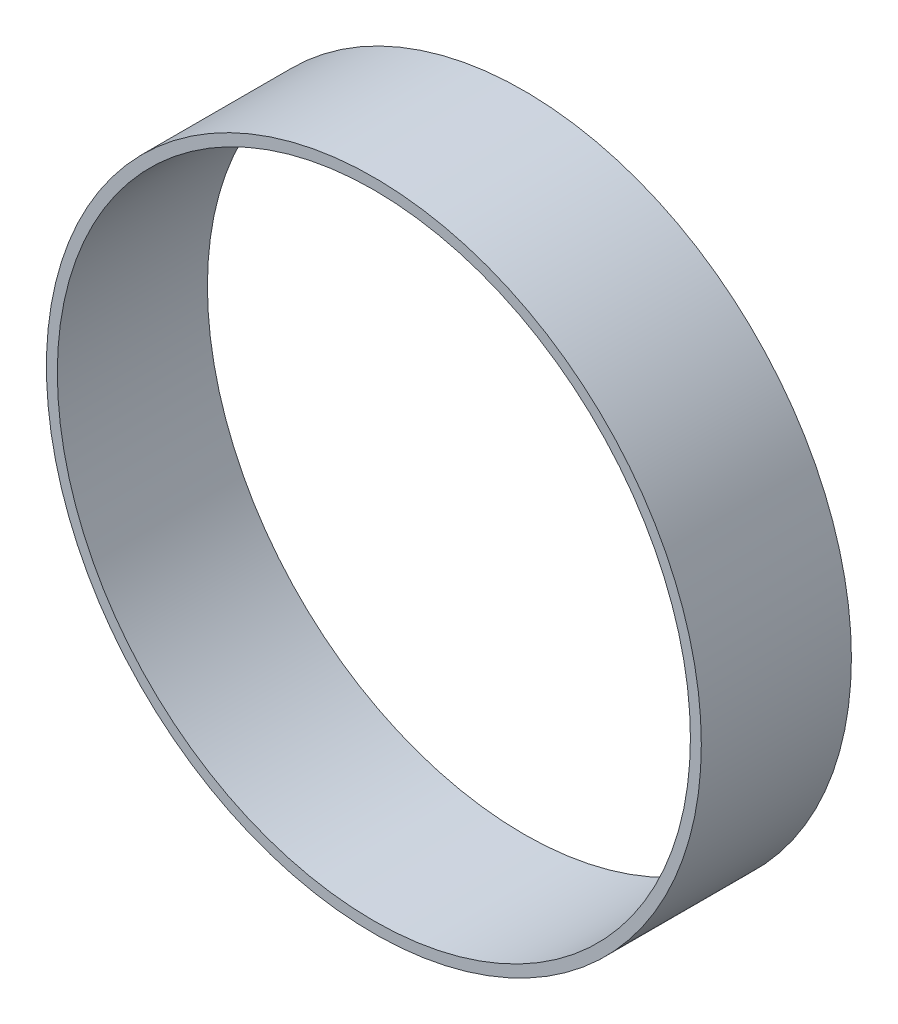
ISO-10303-21;
HEADER;
FILE_DESCRIPTION(('STEP AP214'),'2;1');
FILE_NAME('part.step','',(''),(''),'','','');
FILE_SCHEMA(('AUTOMOTIVE_DESIGN { 1 0 10303 214 1 1 1 1 }'));
ENDSEC;
DATA;
#1=APPLICATION_CONTEXT('core data for automotive mechanical design processes');
#2=APPLICATION_PROTOCOL_DEFINITION('international standard','automotive_design',2000,#1);
#3=PRODUCT_CONTEXT('',#1,'mechanical');
#4=PRODUCT('Part','Part','',(#3));
#5=PRODUCT_RELATED_PRODUCT_CATEGORY('part','',(#4));
#6=PRODUCT_DEFINITION_FORMATION('','',#4);
#7=PRODUCT_DEFINITION_CONTEXT('part definition',#1,'design');
#8=PRODUCT_DEFINITION('design','',#6,#7);
#9=PRODUCT_DEFINITION_SHAPE('','',#8);
#10=(LENGTH_UNIT() NAMED_UNIT(*) SI_UNIT(.MILLI.,.METRE.));
#11=(NAMED_UNIT(*) PLANE_ANGLE_UNIT() SI_UNIT($,.RADIAN.));
#12=(NAMED_UNIT(*) SI_UNIT($,.STERADIAN.) SOLID_ANGLE_UNIT());
#13=UNCERTAINTY_MEASURE_WITH_UNIT(LENGTH_MEASURE(1.E-05),#10,'distance_accuracy_value','');
#14=(GEOMETRIC_REPRESENTATION_CONTEXT(3) GLOBAL_UNCERTAINTY_ASSIGNED_CONTEXT((#13)) GLOBAL_UNIT_ASSIGNED_CONTEXT((#10,
#11,#12)) REPRESENTATION_CONTEXT('',''));
#15=CARTESIAN_POINT('',(0.,0.,0.));
#16=DIRECTION('',(0.,0.,1.));
#17=DIRECTION('',(1.,0.,0.));
#18=AXIS2_PLACEMENT_3D('',#15,#16,#17);
#19=CARTESIAN_POINT('',(0.,0.,34.925));
#20=DIRECTION('',(0.,0.,1.));
#21=DIRECTION('',(1.,0.,0.));
#22=AXIS2_PLACEMENT_3D('',#19,#20,#21);
#23=PLANE('',#22);
#24=CARTESIAN_POINT('',(0.,0.,34.925));
#25=DIRECTION('',(0.,0.,1.));
#26=DIRECTION('',(1.,0.,0.));
#27=AXIS2_PLACEMENT_3D('',#24,#25,#26);
#28=CIRCLE('',#27,76.2);
#29=CARTESIAN_POINT('',(76.2,0.,34.925));
#30=VERTEX_POINT('',#29);
#31=EDGE_CURVE('E10',#30,#30,#28,.T.);
#32=ORIENTED_EDGE('',*,*,#31,.T.);
#33=EDGE_LOOP('',(#32));
#34=FACE_BOUND('',#33,.T.);
#35=CARTESIAN_POINT('',(0.,0.,34.925));
#36=DIRECTION('',(0.,0.,1.));
#37=DIRECTION('',(1.,0.,0.));
#38=AXIS2_PLACEMENT_3D('',#35,#36,#37);
#39=CIRCLE('',#38,73.66);
#40=CARTESIAN_POINT('',(73.66,0.,34.925));
#41=VERTEX_POINT('',#40);
#42=EDGE_CURVE('E42',#41,#41,#39,.T.);
#43=ORIENTED_EDGE('',*,*,#42,.F.);
#44=EDGE_LOOP('',(#43));
#45=FACE_BOUND('',#44,.T.);
#46=ADVANCED_FACE('F31',(#34,#45),#23,.T.);
#47=CARTESIAN_POINT('',(0.,0.,0.));
#48=DIRECTION('',(0.,0.,1.));
#49=DIRECTION('',(1.,0.,0.));
#50=AXIS2_PLACEMENT_3D('',#47,#48,#49);
#51=PLANE('',#50);
#52=CARTESIAN_POINT('',(0.,0.,0.));
#53=DIRECTION('',(0.,0.,1.));
#54=DIRECTION('',(1.,0.,0.));
#55=AXIS2_PLACEMENT_3D('',#52,#53,#54);
#56=CIRCLE('',#55,76.2);
#57=CARTESIAN_POINT('',(76.2,0.,0.));
#58=VERTEX_POINT('',#57);
#59=EDGE_CURVE('E35',#58,#58,#56,.T.);
#60=ORIENTED_EDGE('',*,*,#59,.F.);
#61=EDGE_LOOP('',(#60));
#62=FACE_BOUND('',#61,.T.);
#63=CARTESIAN_POINT('',(0.,0.,0.));
#64=DIRECTION('',(0.,0.,1.));
#65=DIRECTION('',(1.,0.,0.));
#66=AXIS2_PLACEMENT_3D('',#63,#64,#65);
#67=CIRCLE('',#66,73.66);
#68=CARTESIAN_POINT('',(73.66,0.,0.));
#69=VERTEX_POINT('',#68);
#70=EDGE_CURVE('E44',#69,#69,#67,.T.);
#71=ORIENTED_EDGE('',*,*,#70,.T.);
#72=EDGE_LOOP('',(#71));
#73=FACE_BOUND('',#72,.T.);
#74=ADVANCED_FACE('F54',(#62,#73),#51,.F.);
#75=CARTESIAN_POINT('',(0.,0.,34.925));
#76=DIRECTION('',(0.,0.,-1.));
#77=DIRECTION('',(-1.,0.,0.));
#78=AXIS2_PLACEMENT_3D('',#75,#76,#77);
#79=CYLINDRICAL_SURFACE('',#78,76.2);
#80=ORIENTED_EDGE('',*,*,#31,.F.);
#81=EDGE_LOOP('',(#80));
#82=FACE_BOUND('',#81,.T.);
#83=ORIENTED_EDGE('',*,*,#59,.T.);
#84=EDGE_LOOP('',(#83));
#85=FACE_BOUND('',#84,.T.);
#86=ADVANCED_FACE('F33',(#82,#85),#79,.T.);
#87=CARTESIAN_POINT('',(0.,0.,34.925));
#88=DIRECTION('',(0.,0.,-1.));
#89=DIRECTION('',(-1.,0.,0.));
#90=AXIS2_PLACEMENT_3D('',#87,#88,#89);
#91=CYLINDRICAL_SURFACE('',#90,73.66);
#92=ORIENTED_EDGE('',*,*,#42,.T.);
#93=EDGE_LOOP('',(#92));
#94=FACE_BOUND('',#93,.T.);
#95=ORIENTED_EDGE('',*,*,#70,.F.);
#96=EDGE_LOOP('',(#95));
#97=FACE_BOUND('',#96,.T.);
#98=ADVANCED_FACE('F50',(#94,#97),#91,.F.);
#99=CLOSED_SHELL('',(#46,#74,#86,#98));
#100=MANIFOLD_SOLID_BREP('B2',#99);
#101=ADVANCED_BREP_SHAPE_REPRESENTATION('',(#18,#100),#14);
#102=SHAPE_DEFINITION_REPRESENTATION(#9,#101);
ENDSEC;
END-ISO-10303-21;
